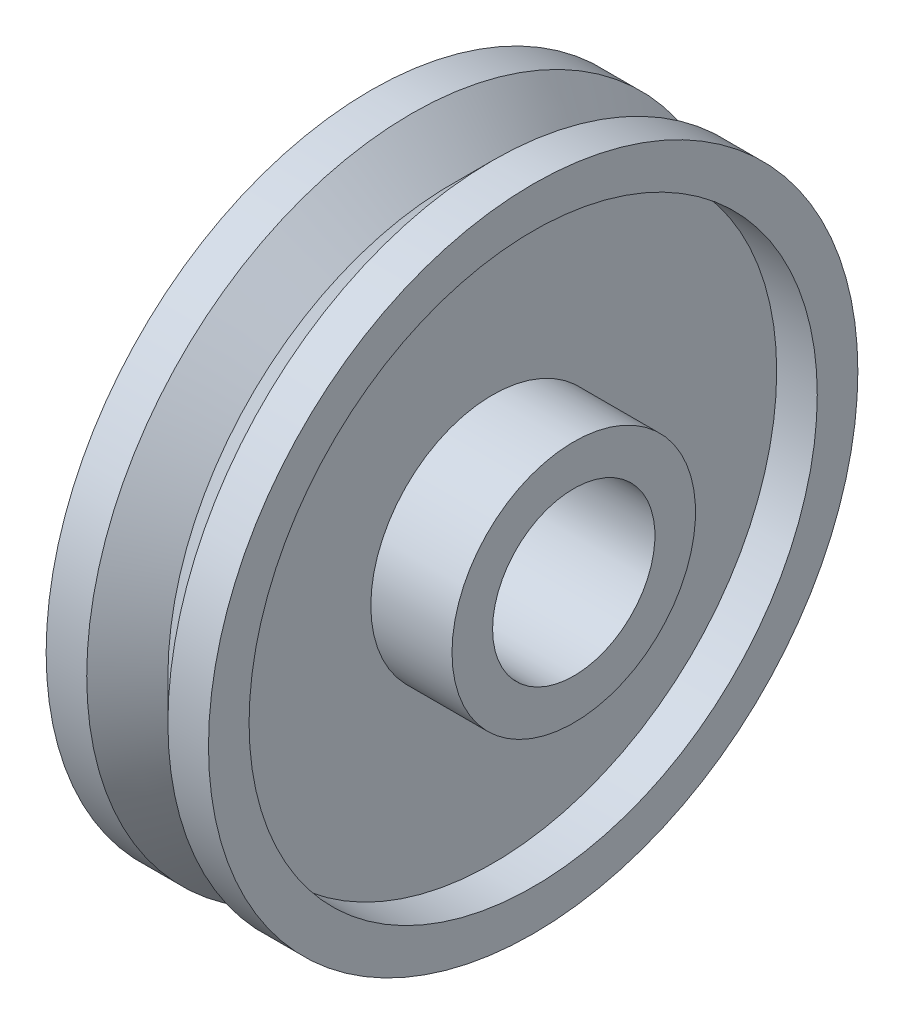
ISO-10303-21;
HEADER;
FILE_DESCRIPTION(('STEP AP214'),'2;1');
FILE_NAME('part.step','',(''),(''),'','','');
FILE_SCHEMA(('AUTOMOTIVE_DESIGN { 1 0 10303 214 1 1 1 1 }'));
ENDSEC;
DATA;
#1=APPLICATION_CONTEXT('core data for automotive mechanical design processes');
#2=APPLICATION_PROTOCOL_DEFINITION('international standard','automotive_design',2000,#1);
#3=PRODUCT_CONTEXT('',#1,'mechanical');
#4=PRODUCT('Part','Part','',(#3));
#5=PRODUCT_RELATED_PRODUCT_CATEGORY('part','',(#4));
#6=PRODUCT_DEFINITION_FORMATION('','',#4);
#7=PRODUCT_DEFINITION_CONTEXT('part definition',#1,'design');
#8=PRODUCT_DEFINITION('design','',#6,#7);
#9=PRODUCT_DEFINITION_SHAPE('','',#8);
#10=(LENGTH_UNIT() NAMED_UNIT(*) SI_UNIT(.MILLI.,.METRE.));
#11=(NAMED_UNIT(*) PLANE_ANGLE_UNIT() SI_UNIT($,.RADIAN.));
#12=(NAMED_UNIT(*) SI_UNIT($,.STERADIAN.) SOLID_ANGLE_UNIT());
#13=UNCERTAINTY_MEASURE_WITH_UNIT(LENGTH_MEASURE(1.E-05),#10,'distance_accuracy_value','');
#14=(GEOMETRIC_REPRESENTATION_CONTEXT(3) GLOBAL_UNCERTAINTY_ASSIGNED_CONTEXT((#13)) GLOBAL_UNIT_ASSIGNED_CONTEXT((#10,
#11,#12)) REPRESENTATION_CONTEXT('',''));
#15=CARTESIAN_POINT('',(0.,0.,0.));
#16=DIRECTION('',(0.,0.,1.));
#17=DIRECTION('',(1.,0.,0.));
#18=AXIS2_PLACEMENT_3D('',#15,#16,#17);
#19=CARTESIAN_POINT('',(-36.1951390300065,0.,0.));
#20=DIRECTION('',(-1.,0.,0.));
#21=DIRECTION('',(0.,0.,1.));
#22=AXIS2_PLACEMENT_3D('',#19,#20,#21);
#23=CYLINDRICAL_SURFACE('',#22,12.7);
#24=CARTESIAN_POINT('',(-19.05,0.,0.));
#25=DIRECTION('',(-1.,0.,0.));
#26=DIRECTION('',(0.,0.,1.));
#27=AXIS2_PLACEMENT_3D('',#24,#25,#26);
#28=CIRCLE('',#27,12.7);
#29=CARTESIAN_POINT('',(-19.05,0.,12.7));
#30=VERTEX_POINT('',#29);
#31=EDGE_CURVE('E82',#30,#30,#28,.T.);
#32=ORIENTED_EDGE('',*,*,#31,.T.);
#33=EDGE_LOOP('',(#32));
#34=FACE_BOUND('',#33,.T.);
#35=CARTESIAN_POINT('',(19.05,0.,0.));
#36=DIRECTION('',(-1.,0.,0.));
#37=DIRECTION('',(0.,0.,1.));
#38=AXIS2_PLACEMENT_3D('',#35,#36,#37);
#39=CIRCLE('',#38,12.7);
#40=CARTESIAN_POINT('',(19.05,0.,12.7));
#41=VERTEX_POINT('',#40);
#42=EDGE_CURVE('E10',#41,#41,#39,.T.);
#43=ORIENTED_EDGE('',*,*,#42,.F.);
#44=EDGE_LOOP('',(#43));
#45=FACE_BOUND('',#44,.T.);
#46=ADVANCED_FACE('F33',(#34,#45),#23,.F.);
#47=CARTESIAN_POINT('',(19.05,0.,0.));
#48=DIRECTION('',(1.,0.,0.));
#49=DIRECTION('',(0.,0.,-1.));
#50=AXIS2_PLACEMENT_3D('',#47,#48,#49);
#51=PLANE('',#50);
#52=ORIENTED_EDGE('',*,*,#42,.T.);
#53=EDGE_LOOP('',(#52));
#54=FACE_BOUND('',#53,.T.);
#55=CARTESIAN_POINT('',(19.05,0.,0.));
#56=DIRECTION('',(-1.,0.,0.));
#57=DIRECTION('',(0.,0.,1.));
#58=AXIS2_PLACEMENT_3D('',#55,#56,#57);
#59=CIRCLE('',#58,19.05);
#60=CARTESIAN_POINT('',(19.05,0.,19.05));
#61=VERTEX_POINT('',#60);
#62=EDGE_CURVE('E39',#61,#61,#59,.T.);
#63=ORIENTED_EDGE('',*,*,#62,.F.);
#64=EDGE_LOOP('',(#63));
#65=FACE_BOUND('',#64,.T.);
#66=ADVANCED_FACE('F142',(#54,#65),#51,.T.);
#67=CARTESIAN_POINT('',(-36.1951390300065,0.,0.));
#68=DIRECTION('',(-1.,0.,0.));
#69=DIRECTION('',(0.,0.,1.));
#70=AXIS2_PLACEMENT_3D('',#67,#68,#69);
#71=CYLINDRICAL_SURFACE('',#70,19.05);
#72=ORIENTED_EDGE('',*,*,#62,.T.);
#73=EDGE_LOOP('',(#72));
#74=FACE_BOUND('',#73,.T.);
#75=CARTESIAN_POINT('',(6.35000000000001,0.,0.));
#76=DIRECTION('',(-1.,0.,0.));
#77=DIRECTION('',(0.,0.,1.));
#78=AXIS2_PLACEMENT_3D('',#75,#76,#77);
#79=CIRCLE('',#78,19.05);
#80=CARTESIAN_POINT('',(6.35000000000001,0.,19.05));
#81=VERTEX_POINT('',#80);
#82=EDGE_CURVE('E43',#81,#81,#79,.T.);
#83=ORIENTED_EDGE('',*,*,#82,.F.);
#84=EDGE_LOOP('',(#83));
#85=FACE_BOUND('',#84,.T.);
#86=ADVANCED_FACE('F146',(#74,#85),#71,.T.);
#87=CARTESIAN_POINT('',(6.35,0.,0.));
#88=DIRECTION('',(1.,0.,0.));
#89=DIRECTION('',(0.,0.,-1.));
#90=AXIS2_PLACEMENT_3D('',#87,#88,#89);
#91=PLANE('',#90);
#92=ORIENTED_EDGE('',*,*,#82,.T.);
#93=EDGE_LOOP('',(#92));
#94=FACE_BOUND('',#93,.T.);
#95=CARTESIAN_POINT('',(6.35,0.,0.));
#96=DIRECTION('',(-1.,0.,0.));
#97=DIRECTION('',(0.,0.,1.));
#98=AXIS2_PLACEMENT_3D('',#95,#96,#97);
#99=CIRCLE('',#98,44.45);
#100=CARTESIAN_POINT('',(6.35,0.,44.45));
#101=VERTEX_POINT('',#100);
#102=EDGE_CURVE('E47',#101,#101,#99,.T.);
#103=ORIENTED_EDGE('',*,*,#102,.F.);
#104=EDGE_LOOP('',(#103));
#105=FACE_BOUND('',#104,.T.);
#106=ADVANCED_FACE('F150',(#94,#105),#91,.T.);
#107=CARTESIAN_POINT('',(-36.1951390300065,0.,0.));
#108=DIRECTION('',(-1.,0.,0.));
#109=DIRECTION('',(0.,0.,1.));
#110=AXIS2_PLACEMENT_3D('',#107,#108,#109);
#111=CYLINDRICAL_SURFACE('',#110,44.45);
#112=ORIENTED_EDGE('',*,*,#102,.T.);
#113=EDGE_LOOP('',(#112));
#114=FACE_BOUND('',#113,.T.);
#115=CARTESIAN_POINT('',(12.7,0.,0.));
#116=DIRECTION('',(-1.,0.,0.));
#117=DIRECTION('',(0.,0.,1.));
#118=AXIS2_PLACEMENT_3D('',#115,#116,#117);
#119=CIRCLE('',#118,44.45);
#120=CARTESIAN_POINT('',(12.7,0.,44.45));
#121=VERTEX_POINT('',#120);
#122=EDGE_CURVE('E52',#121,#121,#119,.T.);
#123=ORIENTED_EDGE('',*,*,#122,.F.);
#124=EDGE_LOOP('',(#123));
#125=FACE_BOUND('',#124,.T.);
#126=ADVANCED_FACE('F156',(#114,#125),#111,.F.);
#127=CARTESIAN_POINT('',(12.7,0.,0.));
#128=DIRECTION('',(1.,0.,0.));
#129=DIRECTION('',(0.,0.,-1.));
#130=AXIS2_PLACEMENT_3D('',#127,#128,#129);
#131=PLANE('',#130);
#132=ORIENTED_EDGE('',*,*,#122,.T.);
#133=EDGE_LOOP('',(#132));
#134=FACE_BOUND('',#133,.T.);
#135=CARTESIAN_POINT('',(12.7,0.,0.));
#136=DIRECTION('',(-1.,0.,0.));
#137=DIRECTION('',(0.,0.,1.));
#138=AXIS2_PLACEMENT_3D('',#135,#136,#137);
#139=CIRCLE('',#138,50.8);
#140=CARTESIAN_POINT('',(12.7,0.,50.8));
#141=VERTEX_POINT('',#140);
#142=EDGE_CURVE('E55',#141,#141,#139,.T.);
#143=ORIENTED_EDGE('',*,*,#142,.F.);
#144=EDGE_LOOP('',(#143));
#145=FACE_BOUND('',#144,.T.);
#146=ADVANCED_FACE('F138',(#134,#145),#131,.T.);
#147=CARTESIAN_POINT('',(-36.1951390300065,0.,0.));
#148=DIRECTION('',(-1.,0.,0.));
#149=DIRECTION('',(0.,0.,1.));
#150=AXIS2_PLACEMENT_3D('',#147,#148,#149);
#151=CYLINDRICAL_SURFACE('',#150,50.8);
#152=ORIENTED_EDGE('',*,*,#142,.T.);
#153=EDGE_LOOP('',(#152));
#154=FACE_BOUND('',#153,.T.);
#155=CARTESIAN_POINT('',(6.34999999999999,0.,0.));
#156=DIRECTION('',(-1.,0.,0.));
#157=DIRECTION('',(0.,0.,1.));
#158=AXIS2_PLACEMENT_3D('',#155,#156,#157);
#159=CIRCLE('',#158,50.8);
#160=CARTESIAN_POINT('',(6.34999999999999,0.,50.8));
#161=VERTEX_POINT('',#160);
#162=EDGE_CURVE('E58',#161,#161,#159,.T.);
#163=ORIENTED_EDGE('',*,*,#162,.F.);
#164=EDGE_LOOP('',(#163));
#165=FACE_BOUND('',#164,.T.);
#166=ADVANCED_FACE('F132',(#154,#165),#151,.T.);
#167=CARTESIAN_POINT('',(0.,0.,0.));
#168=DIRECTION('',(1.,0.,0.));
#169=DIRECTION('',(0.,0.,-1.));
#170=AXIS2_PLACEMENT_3D('',#167,#168,#169);
#171=CONICAL_SURFACE('',#170,44.4499999999999,0.785398163397454);
#172=ORIENTED_EDGE('',*,*,#162,.T.);
#173=EDGE_LOOP('',(#172));
#174=FACE_BOUND('',#173,.T.);
#175=CARTESIAN_POINT('',(0.,0.,0.));
#176=DIRECTION('',(-1.,0.,0.));
#177=DIRECTION('',(0.,0.,1.));
#178=AXIS2_PLACEMENT_3D('',#175,#176,#177);
#179=CIRCLE('',#178,44.4499999999999);
#180=CARTESIAN_POINT('',(0.,0.,44.4499999999999));
#181=VERTEX_POINT('',#180);
#182=EDGE_CURVE('E61',#181,#181,#179,.T.);
#183=ORIENTED_EDGE('',*,*,#182,.F.);
#184=EDGE_LOOP('',(#183));
#185=FACE_BOUND('',#184,.T.);
#186=ADVANCED_FACE('F127',(#174,#185),#171,.T.);
#187=CARTESIAN_POINT('',(0.,0.,0.));
#188=DIRECTION('',(-1.,0.,0.));
#189=DIRECTION('',(0.,0.,1.));
#190=AXIS2_PLACEMENT_3D('',#187,#188,#189);
#191=CONICAL_SURFACE('',#190,44.4499999999999,0.785398163397454);
#192=CARTESIAN_POINT('',(-6.35,0.,0.));
#193=DIRECTION('',(-1.,0.,0.));
#194=DIRECTION('',(0.,0.,1.));
#195=AXIS2_PLACEMENT_3D('',#192,#193,#194);
#196=CIRCLE('',#195,50.8);
#197=CARTESIAN_POINT('',(-6.35,0.,50.8));
#198=VERTEX_POINT('',#197);
#199=EDGE_CURVE('E64',#198,#198,#196,.T.);
#200=ORIENTED_EDGE('',*,*,#199,.F.);
#201=EDGE_LOOP('',(#200));
#202=FACE_BOUND('',#201,.T.);
#203=ORIENTED_EDGE('',*,*,#182,.T.);
#204=EDGE_LOOP('',(#203));
#205=FACE_BOUND('',#204,.T.);
#206=ADVANCED_FACE('F121',(#202,#205),#191,.T.);
#207=CARTESIAN_POINT('',(-36.1951390300065,0.,0.));
#208=DIRECTION('',(-1.,0.,0.));
#209=DIRECTION('',(0.,0.,1.));
#210=AXIS2_PLACEMENT_3D('',#207,#208,#209);
#211=CYLINDRICAL_SURFACE('',#210,50.8);
#212=CARTESIAN_POINT('',(-12.7,0.,0.));
#213=DIRECTION('',(-1.,0.,0.));
#214=DIRECTION('',(0.,0.,1.));
#215=AXIS2_PLACEMENT_3D('',#212,#213,#214);
#216=CIRCLE('',#215,50.8);
#217=CARTESIAN_POINT('',(-12.7,0.,50.8));
#218=VERTEX_POINT('',#217);
#219=EDGE_CURVE('E67',#218,#218,#216,.T.);
#220=ORIENTED_EDGE('',*,*,#219,.F.);
#221=EDGE_LOOP('',(#220));
#222=FACE_BOUND('',#221,.T.);
#223=ORIENTED_EDGE('',*,*,#199,.T.);
#224=EDGE_LOOP('',(#223));
#225=FACE_BOUND('',#224,.T.);
#226=ADVANCED_FACE('F115',(#222,#225),#211,.T.);
#227=CARTESIAN_POINT('',(-12.7,0.,0.));
#228=DIRECTION('',(1.,0.,0.));
#229=DIRECTION('',(0.,0.,-1.));
#230=AXIS2_PLACEMENT_3D('',#227,#228,#229);
#231=PLANE('',#230);
#232=CARTESIAN_POINT('',(-12.7,0.,0.));
#233=DIRECTION('',(-1.,0.,0.));
#234=DIRECTION('',(0.,0.,1.));
#235=AXIS2_PLACEMENT_3D('',#232,#233,#234);
#236=CIRCLE('',#235,44.45);
#237=CARTESIAN_POINT('',(-12.7,0.,44.45));
#238=VERTEX_POINT('',#237);
#239=EDGE_CURVE('E70',#238,#238,#236,.T.);
#240=ORIENTED_EDGE('',*,*,#239,.F.);
#241=EDGE_LOOP('',(#240));
#242=FACE_BOUND('',#241,.T.);
#243=ORIENTED_EDGE('',*,*,#219,.T.);
#244=EDGE_LOOP('',(#243));
#245=FACE_BOUND('',#244,.T.);
#246=ADVANCED_FACE('F109',(#242,#245),#231,.F.);
#247=CARTESIAN_POINT('',(-36.1951390300065,0.,0.));
#248=DIRECTION('',(-1.,0.,0.));
#249=DIRECTION('',(0.,0.,1.));
#250=AXIS2_PLACEMENT_3D('',#247,#248,#249);
#251=CYLINDRICAL_SURFACE('',#250,44.45);
#252=CARTESIAN_POINT('',(-6.35,0.,0.));
#253=DIRECTION('',(-1.,0.,0.));
#254=DIRECTION('',(0.,0.,1.));
#255=AXIS2_PLACEMENT_3D('',#252,#253,#254);
#256=CIRCLE('',#255,44.45);
#257=CARTESIAN_POINT('',(-6.35,0.,44.45));
#258=VERTEX_POINT('',#257);
#259=EDGE_CURVE('E73',#258,#258,#256,.T.);
#260=ORIENTED_EDGE('',*,*,#259,.F.);
#261=EDGE_LOOP('',(#260));
#262=FACE_BOUND('',#261,.T.);
#263=ORIENTED_EDGE('',*,*,#239,.T.);
#264=EDGE_LOOP('',(#263));
#265=FACE_BOUND('',#264,.T.);
#266=ADVANCED_FACE('F103',(#262,#265),#251,.F.);
#267=CARTESIAN_POINT('',(-6.35,0.,0.));
#268=DIRECTION('',(1.,0.,0.));
#269=DIRECTION('',(0.,0.,-1.));
#270=AXIS2_PLACEMENT_3D('',#267,#268,#269);
#271=PLANE('',#270);
#272=CARTESIAN_POINT('',(-6.35,0.,0.));
#273=DIRECTION('',(-1.,0.,0.));
#274=DIRECTION('',(0.,0.,1.));
#275=AXIS2_PLACEMENT_3D('',#272,#273,#274);
#276=CIRCLE('',#275,19.05);
#277=CARTESIAN_POINT('',(-6.35,0.,19.05));
#278=VERTEX_POINT('',#277);
#279=EDGE_CURVE('E76',#278,#278,#276,.T.);
#280=ORIENTED_EDGE('',*,*,#279,.F.);
#281=EDGE_LOOP('',(#280));
#282=FACE_BOUND('',#281,.T.);
#283=ORIENTED_EDGE('',*,*,#259,.T.);
#284=EDGE_LOOP('',(#283));
#285=FACE_BOUND('',#284,.T.);
#286=ADVANCED_FACE('F97',(#282,#285),#271,.F.);
#287=CARTESIAN_POINT('',(-36.1951390300065,0.,0.));
#288=DIRECTION('',(-1.,0.,0.));
#289=DIRECTION('',(0.,0.,1.));
#290=AXIS2_PLACEMENT_3D('',#287,#288,#289);
#291=CYLINDRICAL_SURFACE('',#290,19.05);
#292=CARTESIAN_POINT('',(-19.05,0.,0.));
#293=DIRECTION('',(-1.,0.,0.));
#294=DIRECTION('',(0.,0.,1.));
#295=AXIS2_PLACEMENT_3D('',#292,#293,#294);
#296=CIRCLE('',#295,19.05);
#297=CARTESIAN_POINT('',(-19.05,0.,19.05));
#298=VERTEX_POINT('',#297);
#299=EDGE_CURVE('E79',#298,#298,#296,.T.);
#300=ORIENTED_EDGE('',*,*,#299,.F.);
#301=EDGE_LOOP('',(#300));
#302=FACE_BOUND('',#301,.T.);
#303=ORIENTED_EDGE('',*,*,#279,.T.);
#304=EDGE_LOOP('',(#303));
#305=FACE_BOUND('',#304,.T.);
#306=ADVANCED_FACE('F91',(#302,#305),#291,.T.);
#307=CARTESIAN_POINT('',(-19.05,0.,0.));
#308=DIRECTION('',(1.,0.,0.));
#309=DIRECTION('',(0.,0.,-1.));
#310=AXIS2_PLACEMENT_3D('',#307,#308,#309);
#311=PLANE('',#310);
#312=ORIENTED_EDGE('',*,*,#31,.F.);
#313=EDGE_LOOP('',(#312));
#314=FACE_BOUND('',#313,.T.);
#315=ORIENTED_EDGE('',*,*,#299,.T.);
#316=EDGE_LOOP('',(#315));
#317=FACE_BOUND('',#316,.T.);
#318=ADVANCED_FACE('F88',(#314,#317),#311,.F.);
#319=CLOSED_SHELL('',(#46,#66,#86,#106,#126,#146,#166,#186,#206,#226,#246,#266,#286,#306,#318));
#320=MANIFOLD_SOLID_BREP('B2',#319);
#321=ADVANCED_BREP_SHAPE_REPRESENTATION('',(#18,#320),#14);
#322=SHAPE_DEFINITION_REPRESENTATION(#9,#321);
ENDSEC;
END-ISO-10303-21;
